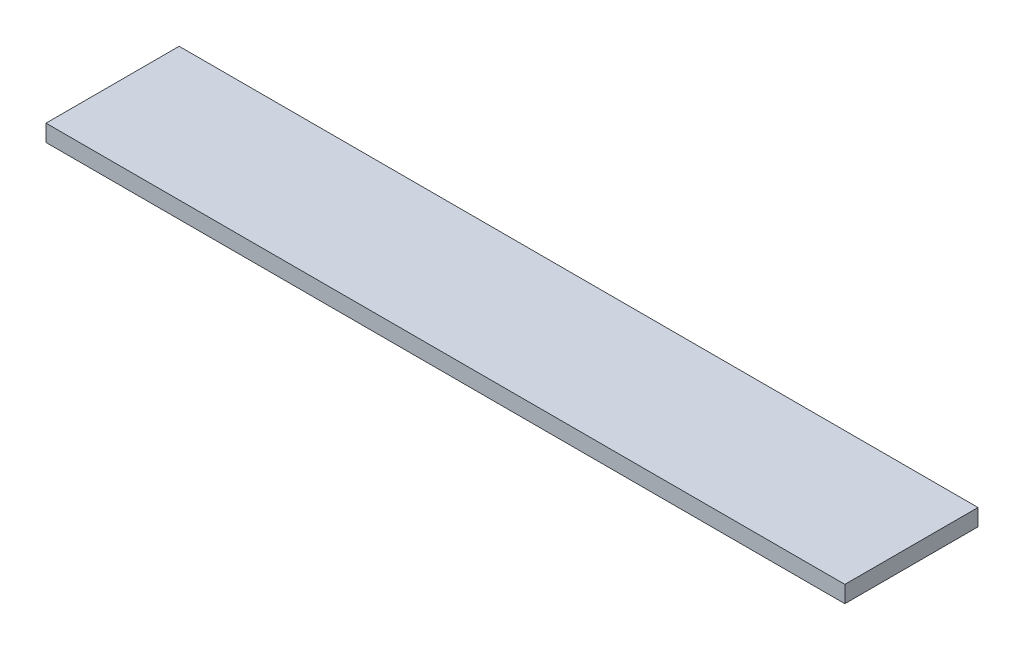
ISO-10303-21;
HEADER;
FILE_DESCRIPTION(('STEP AP214'),'2;1');
FILE_NAME('part.step','',(''),(''),'','','');
FILE_SCHEMA(('AUTOMOTIVE_DESIGN { 1 0 10303 214 1 1 1 1 }'));
ENDSEC;
DATA;
#1=APPLICATION_CONTEXT('core data for automotive mechanical design processes');
#2=APPLICATION_PROTOCOL_DEFINITION('international standard','automotive_design',2000,#1);
#3=PRODUCT_CONTEXT('',#1,'mechanical');
#4=PRODUCT('Part','Part','',(#3));
#5=PRODUCT_RELATED_PRODUCT_CATEGORY('part','',(#4));
#6=PRODUCT_DEFINITION_FORMATION('','',#4);
#7=PRODUCT_DEFINITION_CONTEXT('part definition',#1,'design');
#8=PRODUCT_DEFINITION('design','',#6,#7);
#9=PRODUCT_DEFINITION_SHAPE('','',#8);
#10=(LENGTH_UNIT() NAMED_UNIT(*) SI_UNIT(.MILLI.,.METRE.));
#11=(NAMED_UNIT(*) PLANE_ANGLE_UNIT() SI_UNIT($,.RADIAN.));
#12=(NAMED_UNIT(*) SI_UNIT($,.STERADIAN.) SOLID_ANGLE_UNIT());
#13=UNCERTAINTY_MEASURE_WITH_UNIT(LENGTH_MEASURE(1.E-05),#10,'distance_accuracy_value','');
#14=(GEOMETRIC_REPRESENTATION_CONTEXT(3) GLOBAL_UNCERTAINTY_ASSIGNED_CONTEXT((#13)) GLOBAL_UNIT_ASSIGNED_CONTEXT((#10,
#11,#12)) REPRESENTATION_CONTEXT('',''));
#15=CARTESIAN_POINT('',(0.,0.,0.));
#16=DIRECTION('',(0.,0.,1.));
#17=DIRECTION('',(1.,0.,0.));
#18=AXIS2_PLACEMENT_3D('',#15,#16,#17);
#19=CARTESIAN_POINT('',(38.1,1.6002,6.35));
#20=DIRECTION('',(-1.,0.,0.));
#21=DIRECTION('',(0.,0.,1.));
#22=AXIS2_PLACEMENT_3D('',#19,#20,#21);
#23=PLANE('',#22);
#24=DIRECTION('',(0.,0.,-1.));
#25=VECTOR('',#24,1.);
#26=CARTESIAN_POINT('',(38.1,0.,6.35));
#27=LINE('',#26,#25);
#28=CARTESIAN_POINT('',(38.1,0.,6.35));
#29=VERTEX_POINT('',#28);
#30=CARTESIAN_POINT('',(38.1,0.,-6.35));
#31=VERTEX_POINT('',#30);
#32=EDGE_CURVE('E100',#29,#31,#27,.T.);
#33=ORIENTED_EDGE('',*,*,#32,.T.);
#34=DIRECTION('',(0.,-1.,0.));
#35=VECTOR('',#34,1.);
#36=CARTESIAN_POINT('',(38.1,1.6002,-6.35));
#37=LINE('',#36,#35);
#38=CARTESIAN_POINT('',(38.1,1.6002,-6.35));
#39=VERTEX_POINT('',#38);
#40=EDGE_CURVE('E11',#39,#31,#37,.T.);
#41=ORIENTED_EDGE('',*,*,#40,.F.);
#42=DIRECTION('',(0.,0.,-1.));
#43=VECTOR('',#42,1.);
#44=CARTESIAN_POINT('',(38.1,1.6002,6.35));
#45=LINE('',#44,#43);
#46=CARTESIAN_POINT('',(38.1,1.6002,6.35));
#47=VERTEX_POINT('',#46);
#48=EDGE_CURVE('E88',#47,#39,#45,.T.);
#49=ORIENTED_EDGE('',*,*,#48,.F.);
#50=DIRECTION('',(0.,-1.,0.));
#51=VECTOR('',#50,1.);
#52=CARTESIAN_POINT('',(38.1,1.6002,6.35));
#53=LINE('',#52,#51);
#54=EDGE_CURVE('E96',#47,#29,#53,.T.);
#55=ORIENTED_EDGE('',*,*,#54,.T.);
#56=EDGE_LOOP('',(#33,#41,#49,#55));
#57=FACE_BOUND('',#56,.T.);
#58=ADVANCED_FACE('F37',(#57),#23,.F.);
#59=CARTESIAN_POINT('',(-38.1,1.6002,-6.35));
#60=DIRECTION('',(0.,0.,1.));
#61=DIRECTION('',(1.,0.,0.));
#62=AXIS2_PLACEMENT_3D('',#59,#60,#61);
#63=PLANE('',#62);
#64=DIRECTION('',(-1.,0.,0.));
#65=VECTOR('',#64,1.);
#66=CARTESIAN_POINT('',(-38.1,0.,-6.35));
#67=LINE('',#66,#65);
#68=CARTESIAN_POINT('',(-38.1,0.,-6.35));
#69=VERTEX_POINT('',#68);
#70=EDGE_CURVE('E92',#31,#69,#67,.T.);
#71=ORIENTED_EDGE('',*,*,#70,.T.);
#72=DIRECTION('',(0.,-1.,0.));
#73=VECTOR('',#72,1.);
#74=CARTESIAN_POINT('',(-38.1,1.6002,-6.35));
#75=LINE('',#74,#73);
#76=CARTESIAN_POINT('',(-38.1,1.6002,-6.35));
#77=VERTEX_POINT('',#76);
#78=EDGE_CURVE('E45',#77,#69,#75,.T.);
#79=ORIENTED_EDGE('',*,*,#78,.F.);
#80=DIRECTION('',(-1.,0.,0.));
#81=VECTOR('',#80,1.);
#82=CARTESIAN_POINT('',(-38.1,1.6002,-6.35));
#83=LINE('',#82,#81);
#84=EDGE_CURVE('E83',#39,#77,#83,.T.);
#85=ORIENTED_EDGE('',*,*,#84,.F.);
#86=ORIENTED_EDGE('',*,*,#40,.T.);
#87=EDGE_LOOP('',(#71,#79,#85,#86));
#88=FACE_BOUND('',#87,.T.);
#89=ADVANCED_FACE('F91',(#88),#63,.F.);
#90=CARTESIAN_POINT('',(-38.1,1.6002,6.35));
#91=DIRECTION('',(1.,0.,0.));
#92=DIRECTION('',(0.,0.,-1.));
#93=AXIS2_PLACEMENT_3D('',#90,#91,#92);
#94=PLANE('',#93);
#95=DIRECTION('',(0.,0.,1.));
#96=VECTOR('',#95,1.);
#97=CARTESIAN_POINT('',(-38.1,0.,6.35));
#98=LINE('',#97,#96);
#99=CARTESIAN_POINT('',(-38.1,0.,6.35));
#100=VERTEX_POINT('',#99);
#101=EDGE_CURVE('E70',#69,#100,#98,.T.);
#102=ORIENTED_EDGE('',*,*,#101,.T.);
#103=DIRECTION('',(0.,-1.,0.));
#104=VECTOR('',#103,1.);
#105=CARTESIAN_POINT('',(-38.1,1.6002,6.35));
#106=LINE('',#105,#104);
#107=CARTESIAN_POINT('',(-38.1,1.6002,6.35));
#108=VERTEX_POINT('',#107);
#109=EDGE_CURVE('E93',#108,#100,#106,.T.);
#110=ORIENTED_EDGE('',*,*,#109,.F.);
#111=DIRECTION('',(0.,0.,1.));
#112=VECTOR('',#111,1.);
#113=CARTESIAN_POINT('',(-38.1,1.6002,6.35));
#114=LINE('',#113,#112);
#115=EDGE_CURVE('E86',#77,#108,#114,.T.);
#116=ORIENTED_EDGE('',*,*,#115,.F.);
#117=ORIENTED_EDGE('',*,*,#78,.T.);
#118=EDGE_LOOP('',(#102,#110,#116,#117));
#119=FACE_BOUND('',#118,.T.);
#120=ADVANCED_FACE('F94',(#119),#94,.F.);
#121=CARTESIAN_POINT('',(-38.1,1.6002,6.35));
#122=DIRECTION('',(0.,0.,-1.));
#123=DIRECTION('',(-1.,0.,0.));
#124=AXIS2_PLACEMENT_3D('',#121,#122,#123);
#125=PLANE('',#124);
#126=DIRECTION('',(1.,0.,0.));
#127=VECTOR('',#126,1.);
#128=CARTESIAN_POINT('',(-38.1,0.,6.35));
#129=LINE('',#128,#127);
#130=EDGE_CURVE('E76',#100,#29,#129,.T.);
#131=ORIENTED_EDGE('',*,*,#130,.T.);
#132=ORIENTED_EDGE('',*,*,#54,.F.);
#133=DIRECTION('',(1.,0.,0.));
#134=VECTOR('',#133,1.);
#135=CARTESIAN_POINT('',(-38.1,1.6002,6.35));
#136=LINE('',#135,#134);
#137=EDGE_CURVE('E53',#108,#47,#136,.T.);
#138=ORIENTED_EDGE('',*,*,#137,.F.);
#139=ORIENTED_EDGE('',*,*,#109,.T.);
#140=EDGE_LOOP('',(#131,#132,#138,#139));
#141=FACE_BOUND('',#140,.T.);
#142=ADVANCED_FACE('F107',(#141),#125,.F.);
#143=CARTESIAN_POINT('',(0.,1.6002,0.));
#144=DIRECTION('',(0.,-1.,0.));
#145=DIRECTION('',(0.,0.,-1.));
#146=AXIS2_PLACEMENT_3D('',#143,#144,#145);
#147=PLANE('',#146);
#148=ORIENTED_EDGE('',*,*,#48,.T.);
#149=ORIENTED_EDGE('',*,*,#84,.T.);
#150=ORIENTED_EDGE('',*,*,#115,.T.);
#151=ORIENTED_EDGE('',*,*,#137,.T.);
#152=EDGE_LOOP('',(#148,#149,#150,#151));
#153=FACE_BOUND('',#152,.T.);
#154=ADVANCED_FACE('F84',(#153),#147,.F.);
#155=CARTESIAN_POINT('',(0.,0.,0.));
#156=DIRECTION('',(0.,-1.,0.));
#157=DIRECTION('',(0.,0.,-1.));
#158=AXIS2_PLACEMENT_3D('',#155,#156,#157);
#159=PLANE('',#158);
#160=ORIENTED_EDGE('',*,*,#32,.F.);
#161=ORIENTED_EDGE('',*,*,#130,.F.);
#162=ORIENTED_EDGE('',*,*,#101,.F.);
#163=ORIENTED_EDGE('',*,*,#70,.F.);
#164=EDGE_LOOP('',(#160,#161,#162,#163));
#165=FACE_BOUND('',#164,.T.);
#166=ADVANCED_FACE('F110',(#165),#159,.T.);
#167=CLOSED_SHELL('',(#58,#89,#120,#142,#154,#166));
#168=MANIFOLD_SOLID_BREP('B2',#167);
#169=ADVANCED_BREP_SHAPE_REPRESENTATION('',(#18,#168),#14);
#170=SHAPE_DEFINITION_REPRESENTATION(#9,#169);
ENDSEC;
END-ISO-10303-21;
